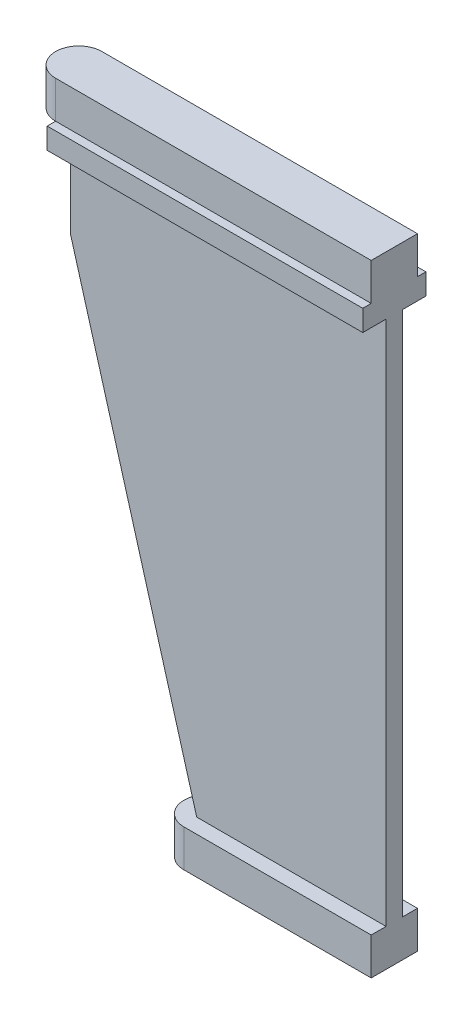
ISO-10303-21;
HEADER;
FILE_DESCRIPTION(('STEP AP214'),'2;1');
FILE_NAME('part.step','',(''),(''),'','','');
FILE_SCHEMA(('AUTOMOTIVE_DESIGN { 1 0 10303 214 1 1 1 1 }'));
ENDSEC;
DATA;
#1=APPLICATION_CONTEXT('core data for automotive mechanical design processes');
#2=APPLICATION_PROTOCOL_DEFINITION('international standard','automotive_design',2000,#1);
#3=PRODUCT_CONTEXT('',#1,'mechanical');
#4=PRODUCT('Part','Part','',(#3));
#5=PRODUCT_RELATED_PRODUCT_CATEGORY('part','',(#4));
#6=PRODUCT_DEFINITION_FORMATION('','',#4);
#7=PRODUCT_DEFINITION_CONTEXT('part definition',#1,'design');
#8=PRODUCT_DEFINITION('design','',#6,#7);
#9=PRODUCT_DEFINITION_SHAPE('','',#8);
#10=(LENGTH_UNIT() NAMED_UNIT(*) SI_UNIT(.MILLI.,.METRE.));
#11=(NAMED_UNIT(*) PLANE_ANGLE_UNIT() SI_UNIT($,.RADIAN.));
#12=(NAMED_UNIT(*) SI_UNIT($,.STERADIAN.) SOLID_ANGLE_UNIT());
#13=UNCERTAINTY_MEASURE_WITH_UNIT(LENGTH_MEASURE(1.E-05),#10,'distance_accuracy_value','');
#14=(GEOMETRIC_REPRESENTATION_CONTEXT(3) GLOBAL_UNCERTAINTY_ASSIGNED_CONTEXT((#13)) GLOBAL_UNIT_ASSIGNED_CONTEXT((#10,
#11,#12)) REPRESENTATION_CONTEXT('',''));
#15=CARTESIAN_POINT('',(0.,0.,0.));
#16=DIRECTION('',(0.,0.,1.));
#17=DIRECTION('',(1.,0.,0.));
#18=AXIS2_PLACEMENT_3D('',#15,#16,#17);
#19=CARTESIAN_POINT('',(0.,0.,2.000000064));
#20=DIRECTION('',(0.,0.,-1.));
#21=DIRECTION('',(-1.,0.,0.));
#22=AXIS2_PLACEMENT_3D('',#19,#20,#21);
#23=PLANE('',#22);
#24=DIRECTION('',(1.,0.,0.));
#25=VECTOR('',#24,1.);
#26=CARTESIAN_POINT('',(0.,63.5,2.000000064));
#27=LINE('',#26,#25);
#28=CARTESIAN_POINT('',(-38.1,63.5,2.000000064));
#29=VERTEX_POINT('',#28);
#30=CARTESIAN_POINT('',(0.,63.5,2.000000064));
#31=VERTEX_POINT('',#30);
#32=EDGE_CURVE('E87',#29,#31,#27,.T.);
#33=ORIENTED_EDGE('',*,*,#32,.F.);
#34=DIRECTION('',(0.,-1.,0.));
#35=VECTOR('',#34,1.);
#36=CARTESIAN_POINT('',(-38.1,53.34,2.000000064));
#37=LINE('',#36,#35);
#38=CARTESIAN_POINT('',(-38.1,53.34,2.000000064));
#39=VERTEX_POINT('',#38);
#40=EDGE_CURVE('E81',#29,#39,#37,.T.);
#41=ORIENTED_EDGE('',*,*,#40,.T.);
#42=DIRECTION('',(0.274721127897378,-0.961523947640823,0.));
#43=VECTOR('',#42,1.);
#44=CARTESIAN_POINT('',(-22.86,0.,2.000000064));
#45=LINE('',#44,#43);
#46=CARTESIAN_POINT('',(-22.86,0.,2.000000064));
#47=VERTEX_POINT('',#46);
#48=EDGE_CURVE('E83',#39,#47,#45,.T.);
#49=ORIENTED_EDGE('',*,*,#48,.T.);
#50=DIRECTION('',(1.,0.,0.));
#51=VECTOR('',#50,1.);
#52=CARTESIAN_POINT('',(0.,0.,2.000000064));
#53=LINE('',#52,#51);
#54=CARTESIAN_POINT('',(0.,0.,2.000000064));
#55=VERTEX_POINT('',#54);
#56=EDGE_CURVE('E49',#47,#55,#53,.T.);
#57=ORIENTED_EDGE('',*,*,#56,.T.);
#58=DIRECTION('',(0.,1.,0.));
#59=VECTOR('',#58,1.);
#60=CARTESIAN_POINT('',(0.,66.04,2.000000064));
#61=LINE('',#60,#59);
#62=EDGE_CURVE('E89',#55,#31,#61,.T.);
#63=ORIENTED_EDGE('',*,*,#62,.T.);
#64=EDGE_LOOP('',(#33,#41,#49,#57,#63));
#65=FACE_BOUND('',#64,.T.);
#66=ADVANCED_FACE('F32',(#65),#23,.F.);
#67=CARTESIAN_POINT('',(0.,0.,0.));
#68=DIRECTION('',(0.,0.,-1.));
#69=DIRECTION('',(-1.,0.,0.));
#70=AXIS2_PLACEMENT_3D('',#67,#68,#69);
#71=PLANE('',#70);
#72=DIRECTION('',(0.,-1.,0.));
#73=VECTOR('',#72,1.);
#74=CARTESIAN_POINT('',(-38.1,53.34,0.));
#75=LINE('',#74,#73);
#76=CARTESIAN_POINT('',(-38.1,63.5,0.));
#77=VERTEX_POINT('',#76);
#78=CARTESIAN_POINT('',(-38.1,53.34,0.));
#79=VERTEX_POINT('',#78);
#80=EDGE_CURVE('E61',#77,#79,#75,.T.);
#81=ORIENTED_EDGE('',*,*,#80,.F.);
#82=DIRECTION('',(1.,0.,0.));
#83=VECTOR('',#82,1.);
#84=CARTESIAN_POINT('',(0.,63.5,0.));
#85=LINE('',#84,#83);
#86=CARTESIAN_POINT('',(0.,63.5,0.));
#87=VERTEX_POINT('',#86);
#88=EDGE_CURVE('E11',#77,#87,#85,.T.);
#89=ORIENTED_EDGE('',*,*,#88,.T.);
#90=DIRECTION('',(0.,1.,0.));
#91=VECTOR('',#90,1.);
#92=CARTESIAN_POINT('',(0.,66.04,0.));
#93=LINE('',#92,#91);
#94=CARTESIAN_POINT('',(0.,0.,0.));
#95=VERTEX_POINT('',#94);
#96=EDGE_CURVE('E105',#95,#87,#93,.T.);
#97=ORIENTED_EDGE('',*,*,#96,.F.);
#98=DIRECTION('',(1.,0.,0.));
#99=VECTOR('',#98,1.);
#100=CARTESIAN_POINT('',(0.,0.,0.));
#101=LINE('',#100,#99);
#102=CARTESIAN_POINT('',(-22.86,0.,0.));
#103=VERTEX_POINT('',#102);
#104=EDGE_CURVE('E70',#103,#95,#101,.T.);
#105=ORIENTED_EDGE('',*,*,#104,.F.);
#106=DIRECTION('',(0.274721127897378,-0.961523947640823,0.));
#107=VECTOR('',#106,1.);
#108=CARTESIAN_POINT('',(-22.86,0.,0.));
#109=LINE('',#108,#107);
#110=EDGE_CURVE('E104',#79,#103,#109,.T.);
#111=ORIENTED_EDGE('',*,*,#110,.F.);
#112=EDGE_LOOP('',(#81,#89,#97,#105,#111));
#113=FACE_BOUND('',#112,.T.);
#114=ADVANCED_FACE('F200',(#113),#71,.T.);
#115=CARTESIAN_POINT('',(-38.1,66.04,1.000000032));
#116=DIRECTION('',(0.,1.,0.));
#117=DIRECTION('',(0.,0.,1.));
#118=AXIS2_PLACEMENT_3D('',#115,#116,#117);
#119=PLANE('',#118);
#120=DIRECTION('',(0.,0.,-1.));
#121=VECTOR('',#120,1.);
#122=CARTESIAN_POINT('',(-38.1,66.04,2.000000064));
#123=LINE('',#122,#121);
#124=CARTESIAN_POINT('',(-38.1,66.04,3.794000032));
#125=VERTEX_POINT('',#124);
#126=CARTESIAN_POINT('',(-38.1,66.04,-1.793999968));
#127=VERTEX_POINT('',#126);
#128=EDGE_CURVE('E41',#125,#127,#123,.T.);
#129=ORIENTED_EDGE('',*,*,#128,.F.);
#130=CARTESIAN_POINT('',(-38.1,66.04,1.000000032));
#131=DIRECTION('',(0.,1.,0.));
#132=DIRECTION('',(0.,0.,1.));
#133=AXIS2_PLACEMENT_3D('',#130,#131,#132);
#134=CIRCLE('',#133,2.794);
#135=EDGE_CURVE('E241',#127,#125,#134,.T.);
#136=ORIENTED_EDGE('',*,*,#135,.F.);
#137=EDGE_LOOP('',(#129,#136));
#138=FACE_BOUND('',#137,.T.);
#139=ADVANCED_FACE('F205',(#138),#119,.F.);
#140=CARTESIAN_POINT('',(0.,66.04,2.000000064));
#141=DIRECTION('',(-1.,0.,0.));
#142=DIRECTION('',(0.,-1.,0.));
#143=AXIS2_PLACEMENT_3D('',#140,#141,#142);
#144=PLANE('',#143);
#145=DIRECTION('',(0.,-1.,0.));
#146=VECTOR('',#145,1.);
#147=CARTESIAN_POINT('',(0.,70.5358,3.79400003199999));
#148=LINE('',#147,#146);
#149=CARTESIAN_POINT('',(0.,70.5358,3.79400003199999));
#150=VERTEX_POINT('',#149);
#151=CARTESIAN_POINT('',(0.,66.04,3.79400003199999));
#152=VERTEX_POINT('',#151);
#153=EDGE_CURVE('E261',#150,#152,#148,.T.);
#154=ORIENTED_EDGE('',*,*,#153,.T.);
#155=DIRECTION('',(0.,0.,1.));
#156=VECTOR('',#155,1.);
#157=CARTESIAN_POINT('',(0.,66.04,4.81000003199999));
#158=LINE('',#157,#156);
#159=CARTESIAN_POINT('',(0.,66.04,4.81000003199999));
#160=VERTEX_POINT('',#159);
#161=EDGE_CURVE('E281',#152,#160,#158,.T.);
#162=ORIENTED_EDGE('',*,*,#161,.T.);
#163=DIRECTION('',(0.,1.,0.));
#164=VECTOR('',#163,1.);
#165=CARTESIAN_POINT('',(0.,63.5,4.81000003199999));
#166=LINE('',#165,#164);
#167=CARTESIAN_POINT('',(0.,63.5,4.81000003199999));
#168=VERTEX_POINT('',#167);
#169=EDGE_CURVE('E280',#168,#160,#166,.T.);
#170=ORIENTED_EDGE('',*,*,#169,.F.);
#171=DIRECTION('',(0.,0.,1.));
#172=VECTOR('',#171,1.);
#173=CARTESIAN_POINT('',(0.,63.5,4.81000003199999));
#174=LINE('',#173,#172);
#175=EDGE_CURVE('E303',#31,#168,#174,.T.);
#176=ORIENTED_EDGE('',*,*,#175,.F.);
#177=ORIENTED_EDGE('',*,*,#62,.F.);
#178=DIRECTION('',(0.,0.,1.));
#179=VECTOR('',#178,1.);
#180=CARTESIAN_POINT('',(0.,0.,3.794000032));
#181=LINE('',#180,#179);
#182=CARTESIAN_POINT('',(0.,0.,3.794000032));
#183=VERTEX_POINT('',#182);
#184=EDGE_CURVE('E137',#55,#183,#181,.T.);
#185=ORIENTED_EDGE('',*,*,#184,.T.);
#186=DIRECTION('',(0.,1.,0.));
#187=VECTOR('',#186,1.);
#188=CARTESIAN_POINT('',(0.,-4.4958,3.794000032));
#189=LINE('',#188,#187);
#190=CARTESIAN_POINT('',(0.,-4.4958,3.794000032));
#191=VERTEX_POINT('',#190);
#192=EDGE_CURVE('E115',#191,#183,#189,.T.);
#193=ORIENTED_EDGE('',*,*,#192,.F.);
#194=DIRECTION('',(0.,0.,1.));
#195=VECTOR('',#194,1.);
#196=CARTESIAN_POINT('',(0.,-4.4958,3.794000032));
#197=LINE('',#196,#195);
#198=CARTESIAN_POINT('',(0.,-4.4958,-1.793999968));
#199=VERTEX_POINT('',#198);
#200=EDGE_CURVE('E151',#199,#191,#197,.T.);
#201=ORIENTED_EDGE('',*,*,#200,.F.);
#202=DIRECTION('',(0.,1.,0.));
#203=VECTOR('',#202,1.);
#204=CARTESIAN_POINT('',(0.,-4.4958,-1.793999968));
#205=LINE('',#204,#203);
#206=CARTESIAN_POINT('',(0.,0.,-1.793999968));
#207=VERTEX_POINT('',#206);
#208=EDGE_CURVE('E152',#199,#207,#205,.T.);
#209=ORIENTED_EDGE('',*,*,#208,.T.);
#210=EDGE_CURVE('E134',#207,#95,#181,.T.);
#211=ORIENTED_EDGE('',*,*,#210,.T.);
#212=ORIENTED_EDGE('',*,*,#96,.T.);
#213=CARTESIAN_POINT('',(0.,63.5,-2.80999996799999));
#214=VERTEX_POINT('',#213);
#215=EDGE_CURVE('E507',#214,#87,#174,.T.);
#216=ORIENTED_EDGE('',*,*,#215,.F.);
#217=DIRECTION('',(0.,1.,0.));
#218=VECTOR('',#217,1.);
#219=CARTESIAN_POINT('',(0.,63.5,-2.80999996799999));
#220=LINE('',#219,#218);
#221=CARTESIAN_POINT('',(0.,66.04,-2.80999996799999));
#222=VERTEX_POINT('',#221);
#223=EDGE_CURVE('E304',#214,#222,#220,.T.);
#224=ORIENTED_EDGE('',*,*,#223,.T.);
#225=CARTESIAN_POINT('',(0.,66.04,-1.793999968));
#226=VERTEX_POINT('',#225);
#227=EDGE_CURVE('E285',#222,#226,#158,.T.);
#228=ORIENTED_EDGE('',*,*,#227,.T.);
#229=DIRECTION('',(0.,-1.,0.));
#230=VECTOR('',#229,1.);
#231=CARTESIAN_POINT('',(0.,70.5358,-1.793999968));
#232=LINE('',#231,#230);
#233=CARTESIAN_POINT('',(0.,70.5358,-1.793999968));
#234=VERTEX_POINT('',#233);
#235=EDGE_CURVE('E262',#234,#226,#232,.T.);
#236=ORIENTED_EDGE('',*,*,#235,.F.);
#237=DIRECTION('',(0.,0.,-1.));
#238=VECTOR('',#237,1.);
#239=CARTESIAN_POINT('',(0.,70.5358,-1.793999968));
#240=LINE('',#239,#238);
#241=EDGE_CURVE('E267',#150,#234,#240,.T.);
#242=ORIENTED_EDGE('',*,*,#241,.F.);
#243=EDGE_LOOP('',(#154,#162,#170,#176,#177,#185,#193,#201,#209,#211,#212,#216,#224,#228,#236,#242));
#244=FACE_BOUND('',#243,.T.);
#245=ADVANCED_FACE('F34',(#244),#144,.F.);
#246=CARTESIAN_POINT('',(-38.1,53.34,2.000000064));
#247=DIRECTION('',(1.,0.,0.));
#248=DIRECTION('',(0.,0.,-1.));
#249=AXIS2_PLACEMENT_3D('',#246,#247,#248);
#250=PLANE('',#249);
#251=ORIENTED_EDGE('',*,*,#128,.T.);
#252=DIRECTION('',(0.,0.,-1.));
#253=VECTOR('',#252,1.);
#254=CARTESIAN_POINT('',(-38.1,66.04,4.810000032));
#255=LINE('',#254,#253);
#256=CARTESIAN_POINT('',(-38.1,66.04,-2.809999968));
#257=VERTEX_POINT('',#256);
#258=EDGE_CURVE('E296',#127,#257,#255,.T.);
#259=ORIENTED_EDGE('',*,*,#258,.T.);
#260=DIRECTION('',(0.,1.,0.));
#261=VECTOR('',#260,1.);
#262=CARTESIAN_POINT('',(-38.1,63.5,-2.809999968));
#263=LINE('',#262,#261);
#264=CARTESIAN_POINT('',(-38.1,63.5,-2.809999968));
#265=VERTEX_POINT('',#264);
#266=EDGE_CURVE('E307',#265,#257,#263,.T.);
#267=ORIENTED_EDGE('',*,*,#266,.F.);
#268=DIRECTION('',(0.,0.,-1.));
#269=VECTOR('',#268,1.);
#270=CARTESIAN_POINT('',(-38.1,63.5,4.810000032));
#271=LINE('',#270,#269);
#272=EDGE_CURVE('E505',#77,#265,#271,.T.);
#273=ORIENTED_EDGE('',*,*,#272,.F.);
#274=ORIENTED_EDGE('',*,*,#80,.T.);
#275=DIRECTION('',(0.,0.,-1.));
#276=VECTOR('',#275,1.);
#277=CARTESIAN_POINT('',(-38.1,53.34,2.000000064));
#278=LINE('',#277,#276);
#279=EDGE_CURVE('E91',#39,#79,#278,.T.);
#280=ORIENTED_EDGE('',*,*,#279,.F.);
#281=ORIENTED_EDGE('',*,*,#40,.F.);
#282=CARTESIAN_POINT('',(-38.1,63.5,4.810000032));
#283=VERTEX_POINT('',#282);
#284=EDGE_CURVE('E509',#283,#29,#271,.T.);
#285=ORIENTED_EDGE('',*,*,#284,.F.);
#286=DIRECTION('',(0.,1.,0.));
#287=VECTOR('',#286,1.);
#288=CARTESIAN_POINT('',(-38.1,63.5,4.810000032));
#289=LINE('',#288,#287);
#290=CARTESIAN_POINT('',(-38.1,66.04,4.810000032));
#291=VERTEX_POINT('',#290);
#292=EDGE_CURVE('E309',#283,#291,#289,.T.);
#293=ORIENTED_EDGE('',*,*,#292,.T.);
#294=EDGE_CURVE('E297',#291,#125,#255,.T.);
#295=ORIENTED_EDGE('',*,*,#294,.T.);
#296=EDGE_LOOP('',(#251,#259,#267,#273,#274,#280,#281,#285,#293,#295));
#297=FACE_BOUND('',#296,.T.);
#298=ADVANCED_FACE('F93',(#297),#250,.F.);
#299=CARTESIAN_POINT('',(-22.86,0.,2.000000064));
#300=DIRECTION('',(0.961523947640823,0.274721127897378,0.));
#301=DIRECTION('',(-0.274721127897378,0.961523947640823,0.));
#302=AXIS2_PLACEMENT_3D('',#299,#300,#301);
#303=PLANE('',#302);
#304=ORIENTED_EDGE('',*,*,#110,.T.);
#305=DIRECTION('',(0.,0.,-1.));
#306=VECTOR('',#305,1.);
#307=CARTESIAN_POINT('',(-22.86,0.,2.000000064));
#308=LINE('',#307,#306);
#309=EDGE_CURVE('E95',#47,#103,#308,.T.);
#310=ORIENTED_EDGE('',*,*,#309,.F.);
#311=ORIENTED_EDGE('',*,*,#48,.F.);
#312=ORIENTED_EDGE('',*,*,#279,.T.);
#313=EDGE_LOOP('',(#304,#310,#311,#312));
#314=FACE_BOUND('',#313,.T.);
#315=ADVANCED_FACE('F97',(#314),#303,.F.);
#316=CARTESIAN_POINT('',(-22.606,0.,1.000000032));
#317=DIRECTION('',(0.,-1.,0.));
#318=DIRECTION('',(1.,0.,0.));
#319=AXIS2_PLACEMENT_3D('',#316,#317,#318);
#320=PLANE('',#319);
#321=ORIENTED_EDGE('',*,*,#309,.T.);
#322=ORIENTED_EDGE('',*,*,#104,.T.);
#323=ORIENTED_EDGE('',*,*,#210,.F.);
#324=DIRECTION('',(1.,0.,0.));
#325=VECTOR('',#324,1.);
#326=CARTESIAN_POINT('',(0.,0.,-1.793999968));
#327=LINE('',#326,#325);
#328=CARTESIAN_POINT('',(-22.606,0.,-1.793999968));
#329=VERTEX_POINT('',#328);
#330=EDGE_CURVE('E148',#329,#207,#327,.T.);
#331=ORIENTED_EDGE('',*,*,#330,.F.);
#332=CARTESIAN_POINT('',(-22.606,0.,1.000000032));
#333=DIRECTION('',(0.,-1.,0.));
#334=DIRECTION('',(1.,0.,0.));
#335=AXIS2_PLACEMENT_3D('',#332,#333,#334);
#336=CIRCLE('',#335,2.794);
#337=CARTESIAN_POINT('',(-22.606,0.,3.794000032));
#338=VERTEX_POINT('',#337);
#339=EDGE_CURVE('E145',#338,#329,#336,.T.);
#340=ORIENTED_EDGE('',*,*,#339,.F.);
#341=DIRECTION('',(-1.,0.,0.));
#342=VECTOR('',#341,1.);
#343=CARTESIAN_POINT('',(0.,0.,3.794000032));
#344=LINE('',#343,#342);
#345=EDGE_CURVE('E136',#183,#338,#344,.T.);
#346=ORIENTED_EDGE('',*,*,#345,.F.);
#347=ORIENTED_EDGE('',*,*,#184,.F.);
#348=ORIENTED_EDGE('',*,*,#56,.F.);
#349=EDGE_LOOP('',(#321,#322,#323,#331,#340,#346,#347,#348));
#350=FACE_BOUND('',#349,.T.);
#351=ADVANCED_FACE('F168',(#350),#320,.F.);
#352=CARTESIAN_POINT('',(0.,-4.4958,3.794000032));
#353=DIRECTION('',(0.,0.,-1.));
#354=DIRECTION('',(-1.,0.,0.));
#355=AXIS2_PLACEMENT_3D('',#352,#353,#354);
#356=PLANE('',#355);
#357=ORIENTED_EDGE('',*,*,#345,.T.);
#358=DIRECTION('',(0.,1.,0.));
#359=VECTOR('',#358,1.);
#360=CARTESIAN_POINT('',(-22.606,-4.4958,3.794000032));
#361=LINE('',#360,#359);
#362=CARTESIAN_POINT('',(-22.606,-4.4958,3.794000032));
#363=VERTEX_POINT('',#362);
#364=EDGE_CURVE('E122',#363,#338,#361,.T.);
#365=ORIENTED_EDGE('',*,*,#364,.F.);
#366=DIRECTION('',(-1.,0.,0.));
#367=VECTOR('',#366,1.);
#368=CARTESIAN_POINT('',(0.,-4.4958,3.794000032));
#369=LINE('',#368,#367);
#370=EDGE_CURVE('E177',#191,#363,#369,.T.);
#371=ORIENTED_EDGE('',*,*,#370,.F.);
#372=ORIENTED_EDGE('',*,*,#192,.T.);
#373=EDGE_LOOP('',(#357,#365,#371,#372));
#374=FACE_BOUND('',#373,.T.);
#375=ADVANCED_FACE('F208',(#374),#356,.F.);
#376=CARTESIAN_POINT('',(-22.606,-4.4958,1.000000032));
#377=DIRECTION('',(0.,1.,0.));
#378=DIRECTION('',(-1.,0.,0.));
#379=AXIS2_PLACEMENT_3D('',#376,#377,#378);
#380=CYLINDRICAL_SURFACE('',#379,2.794);
#381=ORIENTED_EDGE('',*,*,#339,.T.);
#382=DIRECTION('',(0.,1.,0.));
#383=VECTOR('',#382,1.);
#384=CARTESIAN_POINT('',(-22.606,-4.4958,-1.793999968));
#385=LINE('',#384,#383);
#386=CARTESIAN_POINT('',(-22.606,-4.4958,-1.793999968));
#387=VERTEX_POINT('',#386);
#388=EDGE_CURVE('E130',#387,#329,#385,.T.);
#389=ORIENTED_EDGE('',*,*,#388,.F.);
#390=CARTESIAN_POINT('',(-22.606,-4.4958,1.000000032));
#391=DIRECTION('',(0.,-1.,0.));
#392=DIRECTION('',(1.,0.,0.));
#393=AXIS2_PLACEMENT_3D('',#390,#391,#392);
#394=CIRCLE('',#393,2.794);
#395=EDGE_CURVE('E179',#363,#387,#394,.T.);
#396=ORIENTED_EDGE('',*,*,#395,.F.);
#397=ORIENTED_EDGE('',*,*,#364,.T.);
#398=EDGE_LOOP('',(#381,#389,#396,#397));
#399=FACE_BOUND('',#398,.T.);
#400=ADVANCED_FACE('F196',(#399),#380,.T.);
#401=CARTESIAN_POINT('',(0.,-4.4958,-1.793999968));
#402=DIRECTION('',(0.,0.,1.));
#403=DIRECTION('',(1.,0.,0.));
#404=AXIS2_PLACEMENT_3D('',#401,#402,#403);
#405=PLANE('',#404);
#406=ORIENTED_EDGE('',*,*,#330,.T.);
#407=ORIENTED_EDGE('',*,*,#208,.F.);
#408=DIRECTION('',(1.,0.,0.));
#409=VECTOR('',#408,1.);
#410=CARTESIAN_POINT('',(0.,-4.4958,-1.793999968));
#411=LINE('',#410,#409);
#412=EDGE_CURVE('E141',#387,#199,#411,.T.);
#413=ORIENTED_EDGE('',*,*,#412,.F.);
#414=ORIENTED_EDGE('',*,*,#388,.T.);
#415=EDGE_LOOP('',(#406,#407,#413,#414));
#416=FACE_BOUND('',#415,.T.);
#417=ADVANCED_FACE('F160',(#416),#405,.F.);
#418=CARTESIAN_POINT('',(-22.606,-4.4958,1.000000032));
#419=DIRECTION('',(0.,-1.,0.));
#420=DIRECTION('',(1.,0.,0.));
#421=AXIS2_PLACEMENT_3D('',#418,#419,#420);
#422=PLANE('',#421);
#423=ORIENTED_EDGE('',*,*,#200,.T.);
#424=ORIENTED_EDGE('',*,*,#370,.T.);
#425=ORIENTED_EDGE('',*,*,#395,.T.);
#426=ORIENTED_EDGE('',*,*,#412,.T.);
#427=EDGE_LOOP('',(#423,#424,#425,#426));
#428=FACE_BOUND('',#427,.T.);
#429=ADVANCED_FACE('F185',(#428),#422,.T.);
#430=CARTESIAN_POINT('',(0.,70.5358,-1.793999968));
#431=DIRECTION('',(0.,0.,1.));
#432=DIRECTION('',(1.,0.,0.));
#433=AXIS2_PLACEMENT_3D('',#430,#431,#432);
#434=PLANE('',#433);
#435=DIRECTION('',(-1.,0.,0.));
#436=VECTOR('',#435,1.);
#437=CARTESIAN_POINT('',(0.,66.04,-1.793999968));
#438=LINE('',#437,#436);
#439=EDGE_CURVE('E253',#226,#127,#438,.T.);
#440=ORIENTED_EDGE('',*,*,#439,.T.);
#441=DIRECTION('',(0.,-1.,0.));
#442=VECTOR('',#441,1.);
#443=CARTESIAN_POINT('',(-38.1,70.5358,-1.793999968));
#444=LINE('',#443,#442);
#445=CARTESIAN_POINT('',(-38.1,70.5358,-1.793999968));
#446=VERTEX_POINT('',#445);
#447=EDGE_CURVE('E182',#446,#127,#444,.T.);
#448=ORIENTED_EDGE('',*,*,#447,.F.);
#449=DIRECTION('',(-1.,0.,0.));
#450=VECTOR('',#449,1.);
#451=CARTESIAN_POINT('',(0.,70.5358,-1.793999968));
#452=LINE('',#451,#450);
#453=EDGE_CURVE('E268',#234,#446,#452,.T.);
#454=ORIENTED_EDGE('',*,*,#453,.F.);
#455=ORIENTED_EDGE('',*,*,#235,.T.);
#456=EDGE_LOOP('',(#440,#448,#454,#455));
#457=FACE_BOUND('',#456,.T.);
#458=ADVANCED_FACE('F187',(#457),#434,.F.);
#459=CARTESIAN_POINT('',(-38.1,70.5358,1.000000032));
#460=DIRECTION('',(0.,-1.,0.));
#461=DIRECTION('',(0.,0.,-1.));
#462=AXIS2_PLACEMENT_3D('',#459,#460,#461);
#463=CYLINDRICAL_SURFACE('',#462,2.794);
#464=ORIENTED_EDGE('',*,*,#135,.T.);
#465=DIRECTION('',(0.,-1.,0.));
#466=VECTOR('',#465,1.);
#467=CARTESIAN_POINT('',(-38.1,70.5358,3.794000032));
#468=LINE('',#467,#466);
#469=CARTESIAN_POINT('',(-38.1,70.5358,3.794000032));
#470=VERTEX_POINT('',#469);
#471=EDGE_CURVE('E245',#470,#125,#468,.T.);
#472=ORIENTED_EDGE('',*,*,#471,.F.);
#473=CARTESIAN_POINT('',(-38.1,70.5358,1.000000032));
#474=DIRECTION('',(0.,1.,0.));
#475=DIRECTION('',(0.,0.,1.));
#476=AXIS2_PLACEMENT_3D('',#473,#474,#475);
#477=CIRCLE('',#476,2.794);
#478=EDGE_CURVE('E274',#446,#470,#477,.T.);
#479=ORIENTED_EDGE('',*,*,#478,.F.);
#480=ORIENTED_EDGE('',*,*,#447,.T.);
#481=EDGE_LOOP('',(#464,#472,#479,#480));
#482=FACE_BOUND('',#481,.T.);
#483=ADVANCED_FACE('F193',(#482),#463,.T.);
#484=CARTESIAN_POINT('',(-38.1,70.5358,3.794000032));
#485=DIRECTION('',(0.,0.,-1.));
#486=DIRECTION('',(-1.,0.,0.));
#487=AXIS2_PLACEMENT_3D('',#484,#485,#486);
#488=PLANE('',#487);
#489=DIRECTION('',(1.,0.,0.));
#490=VECTOR('',#489,1.);
#491=CARTESIAN_POINT('',(-38.1,66.04,3.794000032));
#492=LINE('',#491,#490);
#493=EDGE_CURVE('E252',#125,#152,#492,.T.);
#494=ORIENTED_EDGE('',*,*,#493,.T.);
#495=ORIENTED_EDGE('',*,*,#153,.F.);
#496=DIRECTION('',(1.,0.,0.));
#497=VECTOR('',#496,1.);
#498=CARTESIAN_POINT('',(-38.1,70.5358,3.794000032));
#499=LINE('',#498,#497);
#500=EDGE_CURVE('E260',#470,#150,#499,.T.);
#501=ORIENTED_EDGE('',*,*,#500,.F.);
#502=ORIENTED_EDGE('',*,*,#471,.T.);
#503=EDGE_LOOP('',(#494,#495,#501,#502));
#504=FACE_BOUND('',#503,.T.);
#505=ADVANCED_FACE('F228',(#504),#488,.F.);
#506=CARTESIAN_POINT('',(-38.1,70.5358,1.000000032));
#507=DIRECTION('',(0.,1.,0.));
#508=DIRECTION('',(0.,0.,1.));
#509=AXIS2_PLACEMENT_3D('',#506,#507,#508);
#510=PLANE('',#509);
#511=ORIENTED_EDGE('',*,*,#453,.T.);
#512=ORIENTED_EDGE('',*,*,#478,.T.);
#513=ORIENTED_EDGE('',*,*,#500,.T.);
#514=ORIENTED_EDGE('',*,*,#241,.T.);
#515=EDGE_LOOP('',(#511,#512,#513,#514));
#516=FACE_BOUND('',#515,.T.);
#517=ADVANCED_FACE('F226',(#516),#510,.T.);
#518=CARTESIAN_POINT('',(0.,63.5,4.81000003199999));
#519=DIRECTION('',(0.,0.,-1.));
#520=DIRECTION('',(-1.,0.,0.));
#521=AXIS2_PLACEMENT_3D('',#518,#519,#520);
#522=PLANE('',#521);
#523=DIRECTION('',(-1.,0.,0.));
#524=VECTOR('',#523,1.);
#525=CARTESIAN_POINT('',(0.,66.04,4.81000003199999));
#526=LINE('',#525,#524);
#527=EDGE_CURVE('E291',#160,#291,#526,.T.);
#528=ORIENTED_EDGE('',*,*,#527,.T.);
#529=ORIENTED_EDGE('',*,*,#292,.F.);
#530=DIRECTION('',(-1.,0.,0.));
#531=VECTOR('',#530,1.);
#532=CARTESIAN_POINT('',(0.,63.5,4.81000003199999));
#533=LINE('',#532,#531);
#534=EDGE_CURVE('E323',#168,#283,#533,.T.);
#535=ORIENTED_EDGE('',*,*,#534,.F.);
#536=ORIENTED_EDGE('',*,*,#169,.T.);
#537=EDGE_LOOP('',(#528,#529,#535,#536));
#538=FACE_BOUND('',#537,.T.);
#539=ADVANCED_FACE('F319',(#538),#522,.F.);
#540=CARTESIAN_POINT('',(0.,66.04,0.));
#541=DIRECTION('',(0.,1.,0.));
#542=DIRECTION('',(0.,0.,1.));
#543=AXIS2_PLACEMENT_3D('',#540,#541,#542);
#544=PLANE('',#543);
#545=ORIENTED_EDGE('',*,*,#493,.F.);
#546=ORIENTED_EDGE('',*,*,#294,.F.);
#547=ORIENTED_EDGE('',*,*,#527,.F.);
#548=ORIENTED_EDGE('',*,*,#161,.F.);
#549=EDGE_LOOP('',(#545,#546,#547,#548));
#550=FACE_BOUND('',#549,.T.);
#551=ADVANCED_FACE('F456',(#550),#544,.T.);
#552=CARTESIAN_POINT('',(0.,63.5,0.));
#553=DIRECTION('',(0.,1.,0.));
#554=DIRECTION('',(0.,0.,1.));
#555=AXIS2_PLACEMENT_3D('',#552,#553,#554);
#556=PLANE('',#555);
#557=ORIENTED_EDGE('',*,*,#284,.T.);
#558=ORIENTED_EDGE('',*,*,#32,.T.);
#559=ORIENTED_EDGE('',*,*,#175,.T.);
#560=ORIENTED_EDGE('',*,*,#534,.T.);
#561=EDGE_LOOP('',(#557,#558,#559,#560));
#562=FACE_BOUND('',#561,.T.);
#563=ADVANCED_FACE('F464',(#562),#556,.F.);
#564=ORIENTED_EDGE('',*,*,#439,.F.);
#565=ORIENTED_EDGE('',*,*,#227,.F.);
#566=DIRECTION('',(1.,0.,0.));
#567=VECTOR('',#566,1.);
#568=CARTESIAN_POINT('',(0.,66.04,-2.80999996799999));
#569=LINE('',#568,#567);
#570=EDGE_CURVE('E300',#257,#222,#569,.T.);
#571=ORIENTED_EDGE('',*,*,#570,.F.);
#572=ORIENTED_EDGE('',*,*,#258,.F.);
#573=EDGE_LOOP('',(#564,#565,#571,#572));
#574=FACE_BOUND('',#573,.T.);
#575=ADVANCED_FACE('F467',(#574),#544,.T.);
#576=CARTESIAN_POINT('',(0.,63.5,-2.80999996799999));
#577=DIRECTION('',(0.,0.,1.));
#578=DIRECTION('',(1.,0.,0.));
#579=AXIS2_PLACEMENT_3D('',#576,#577,#578);
#580=PLANE('',#579);
#581=ORIENTED_EDGE('',*,*,#570,.T.);
#582=ORIENTED_EDGE('',*,*,#223,.F.);
#583=DIRECTION('',(1.,0.,0.));
#584=VECTOR('',#583,1.);
#585=CARTESIAN_POINT('',(0.,63.5,-2.80999996799999));
#586=LINE('',#585,#584);
#587=EDGE_CURVE('E292',#265,#214,#586,.T.);
#588=ORIENTED_EDGE('',*,*,#587,.F.);
#589=ORIENTED_EDGE('',*,*,#266,.T.);
#590=EDGE_LOOP('',(#581,#582,#588,#589));
#591=FACE_BOUND('',#590,.T.);
#592=ADVANCED_FACE('F484',(#591),#580,.F.);
#593=ORIENTED_EDGE('',*,*,#88,.F.);
#594=ORIENTED_EDGE('',*,*,#272,.T.);
#595=ORIENTED_EDGE('',*,*,#587,.T.);
#596=ORIENTED_EDGE('',*,*,#215,.T.);
#597=EDGE_LOOP('',(#593,#594,#595,#596));
#598=FACE_BOUND('',#597,.T.);
#599=ADVANCED_FACE('F476',(#598),#556,.F.);
#600=CLOSED_SHELL('',(#66,#114,#139,#245,#298,#315,#351,#375,#400,#417,#429,#458,#483,#505,#517,
#539,#551,#563,#575,#592,#599));
#601=MANIFOLD_SOLID_BREP('B2',#600);
#602=ADVANCED_BREP_SHAPE_REPRESENTATION('',(#18,#601),#14);
#603=SHAPE_DEFINITION_REPRESENTATION(#9,#602);
ENDSEC;
END-ISO-10303-21;
